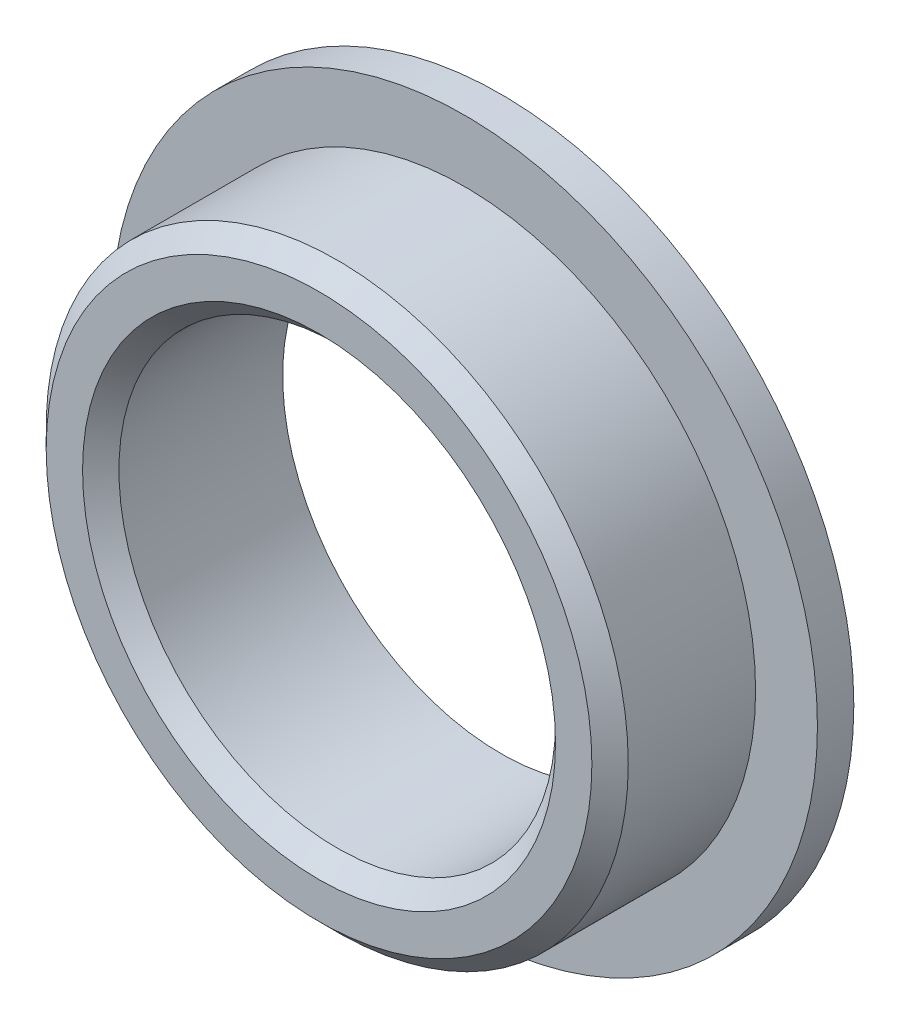
ISO-10303-21;
HEADER;
FILE_DESCRIPTION(('STEP AP214'),'2;1');
FILE_NAME('part.step','',(''),(''),'','','');
FILE_SCHEMA(('AUTOMOTIVE_DESIGN { 1 0 10303 214 1 1 1 1 }'));
ENDSEC;
DATA;
#1=APPLICATION_CONTEXT('core data for automotive mechanical design processes');
#2=APPLICATION_PROTOCOL_DEFINITION('international standard','automotive_design',2000,#1);
#3=PRODUCT_CONTEXT('',#1,'mechanical');
#4=PRODUCT('Part','Part','',(#3));
#5=PRODUCT_RELATED_PRODUCT_CATEGORY('part','',(#4));
#6=PRODUCT_DEFINITION_FORMATION('','',#4);
#7=PRODUCT_DEFINITION_CONTEXT('part definition',#1,'design');
#8=PRODUCT_DEFINITION('design','',#6,#7);
#9=PRODUCT_DEFINITION_SHAPE('','',#8);
#10=(LENGTH_UNIT() NAMED_UNIT(*) SI_UNIT(.MILLI.,.METRE.));
#11=(NAMED_UNIT(*) PLANE_ANGLE_UNIT() SI_UNIT($,.RADIAN.));
#12=(NAMED_UNIT(*) SI_UNIT($,.STERADIAN.) SOLID_ANGLE_UNIT());
#13=UNCERTAINTY_MEASURE_WITH_UNIT(LENGTH_MEASURE(1.E-05),#10,'distance_accuracy_value','');
#14=(GEOMETRIC_REPRESENTATION_CONTEXT(3) GLOBAL_UNCERTAINTY_ASSIGNED_CONTEXT((#13)) GLOBAL_UNIT_ASSIGNED_CONTEXT((#10,
#11,#12)) REPRESENTATION_CONTEXT('',''));
#15=CARTESIAN_POINT('',(0.,0.,0.));
#16=DIRECTION('',(0.,0.,1.));
#17=DIRECTION('',(1.,0.,0.));
#18=AXIS2_PLACEMENT_3D('',#15,#16,#17);
#19=CARTESIAN_POINT('',(0.,0.,0.5));
#20=DIRECTION('',(0.,0.,1.));
#21=DIRECTION('',(1.,0.,0.));
#22=AXIS2_PLACEMENT_3D('',#19,#20,#21);
#23=PLANE('',#22);
#24=CARTESIAN_POINT('',(0.,0.,0.5));
#25=DIRECTION('',(0.,0.,1.));
#26=DIRECTION('',(1.,0.,0.));
#27=AXIS2_PLACEMENT_3D('',#24,#25,#26);
#28=CIRCLE('',#27,4.85);
#29=CARTESIAN_POINT('',(4.85,0.,0.5));
#30=VERTEX_POINT('',#29);
#31=EDGE_CURVE('E50',#30,#30,#28,.T.);
#32=ORIENTED_EDGE('',*,*,#31,.T.);
#33=EDGE_LOOP('',(#32));
#34=FACE_BOUND('',#33,.T.);
#35=CARTESIAN_POINT('',(0.,0.,0.5));
#36=DIRECTION('',(0.,0.,1.));
#37=DIRECTION('',(1.,0.,0.));
#38=AXIS2_PLACEMENT_3D('',#35,#36,#37);
#39=CIRCLE('',#38,4.);
#40=CARTESIAN_POINT('',(4.,0.,0.5));
#41=VERTEX_POINT('',#40);
#42=EDGE_CURVE('E54',#41,#41,#39,.T.);
#43=ORIENTED_EDGE('',*,*,#42,.F.);
#44=EDGE_LOOP('',(#43));
#45=FACE_BOUND('',#44,.T.);
#46=ADVANCED_FACE('F30',(#34,#45),#23,.T.);
#47=CARTESIAN_POINT('',(0.,0.,0.5));
#48=DIRECTION('',(0.,0.,-1.));
#49=DIRECTION('',(-1.,0.,0.));
#50=AXIS2_PLACEMENT_3D('',#47,#48,#49);
#51=CYLINDRICAL_SURFACE('',#50,4.85);
#52=ORIENTED_EDGE('',*,*,#31,.F.);
#53=EDGE_LOOP('',(#52));
#54=FACE_BOUND('',#53,.T.);
#55=CARTESIAN_POINT('',(0.,0.,0.));
#56=DIRECTION('',(0.,0.,1.));
#57=DIRECTION('',(1.,0.,0.));
#58=AXIS2_PLACEMENT_3D('',#55,#56,#57);
#59=CIRCLE('',#58,4.85);
#60=CARTESIAN_POINT('',(4.85,0.,0.));
#61=VERTEX_POINT('',#60);
#62=EDGE_CURVE('E51',#61,#61,#59,.T.);
#63=ORIENTED_EDGE('',*,*,#62,.T.);
#64=EDGE_LOOP('',(#63));
#65=FACE_BOUND('',#64,.T.);
#66=ADVANCED_FACE('F80',(#54,#65),#51,.T.);
#67=CARTESIAN_POINT('',(0.,0.,0.));
#68=DIRECTION('',(0.,0.,1.));
#69=DIRECTION('',(1.,0.,0.));
#70=AXIS2_PLACEMENT_3D('',#67,#68,#69);
#71=PLANE('',#70);
#72=CARTESIAN_POINT('',(0.,0.,0.));
#73=DIRECTION('',(0.,0.,1.));
#74=DIRECTION('',(1.,0.,0.));
#75=AXIS2_PLACEMENT_3D('',#72,#73,#74);
#76=CIRCLE('',#75,3.);
#77=CARTESIAN_POINT('',(3.,0.,0.));
#78=VERTEX_POINT('',#77);
#79=EDGE_CURVE('E59',#78,#78,#76,.T.);
#80=ORIENTED_EDGE('',*,*,#79,.T.);
#81=EDGE_LOOP('',(#80));
#82=FACE_BOUND('',#81,.T.);
#83=ORIENTED_EDGE('',*,*,#62,.F.);
#84=EDGE_LOOP('',(#83));
#85=FACE_BOUND('',#84,.T.);
#86=ADVANCED_FACE('F63',(#82,#85),#71,.F.);
#87=CARTESIAN_POINT('',(0.,0.,2.5));
#88=DIRECTION('',(0.,0.,-1.));
#89=DIRECTION('',(-1.,0.,0.));
#90=AXIS2_PLACEMENT_3D('',#87,#88,#89);
#91=CYLINDRICAL_SURFACE('',#90,4.);
#92=CARTESIAN_POINT('',(0.,0.,2.25));
#93=DIRECTION('',(0.,0.,1.));
#94=DIRECTION('',(1.,0.,0.));
#95=AXIS2_PLACEMENT_3D('',#92,#93,#94);
#96=CIRCLE('',#95,4.);
#97=CARTESIAN_POINT('',(4.,0.,2.25));
#98=VERTEX_POINT('',#97);
#99=EDGE_CURVE('E37',#98,#98,#96,.F.);
#100=ORIENTED_EDGE('',*,*,#99,.T.);
#101=EDGE_LOOP('',(#100));
#102=FACE_BOUND('',#101,.T.);
#103=ORIENTED_EDGE('',*,*,#42,.T.);
#104=EDGE_LOOP('',(#103));
#105=FACE_BOUND('',#104,.T.);
#106=ADVANCED_FACE('F76',(#102,#105),#91,.T.);
#107=CARTESIAN_POINT('',(0.,0.,2.5));
#108=DIRECTION('',(0.,0.,1.));
#109=DIRECTION('',(1.,0.,0.));
#110=AXIS2_PLACEMENT_3D('',#107,#108,#109);
#111=PLANE('',#110);
#112=CARTESIAN_POINT('',(0.,0.,2.5));
#113=DIRECTION('',(0.,0.,1.));
#114=DIRECTION('',(1.,0.,0.));
#115=AXIS2_PLACEMENT_3D('',#112,#113,#114);
#116=CIRCLE('',#115,3.75);
#117=CARTESIAN_POINT('',(3.75,0.,2.5));
#118=VERTEX_POINT('',#117);
#119=EDGE_CURVE('E41',#118,#118,#116,.T.);
#120=ORIENTED_EDGE('',*,*,#119,.T.);
#121=EDGE_LOOP('',(#120));
#122=FACE_BOUND('',#121,.T.);
#123=CARTESIAN_POINT('',(0.,0.,2.5));
#124=DIRECTION('',(0.,0.,1.));
#125=DIRECTION('',(1.,0.,0.));
#126=AXIS2_PLACEMENT_3D('',#123,#124,#125);
#127=CIRCLE('',#126,3.25);
#128=CARTESIAN_POINT('',(3.25,0.,2.5));
#129=VERTEX_POINT('',#128);
#130=EDGE_CURVE('E45',#129,#129,#127,.F.);
#131=ORIENTED_EDGE('',*,*,#130,.T.);
#132=EDGE_LOOP('',(#131));
#133=FACE_BOUND('',#132,.T.);
#134=ADVANCED_FACE('F69',(#122,#133),#111,.T.);
#135=CARTESIAN_POINT('',(0.,0.,0.));
#136=DIRECTION('',(0.,0.,1.));
#137=DIRECTION('',(1.,0.,0.));
#138=AXIS2_PLACEMENT_3D('',#135,#136,#137);
#139=CYLINDRICAL_SURFACE('',#138,3.);
#140=CARTESIAN_POINT('',(0.,0.,2.25));
#141=DIRECTION('',(0.,0.,1.));
#142=DIRECTION('',(1.,0.,0.));
#143=AXIS2_PLACEMENT_3D('',#140,#141,#142);
#144=CIRCLE('',#143,3.);
#145=CARTESIAN_POINT('',(3.,0.,2.25));
#146=VERTEX_POINT('',#145);
#147=EDGE_CURVE('E10',#146,#146,#144,.T.);
#148=ORIENTED_EDGE('',*,*,#147,.T.);
#149=EDGE_LOOP('',(#148));
#150=FACE_BOUND('',#149,.T.);
#151=ORIENTED_EDGE('',*,*,#79,.F.);
#152=EDGE_LOOP('',(#151));
#153=FACE_BOUND('',#152,.T.);
#154=ADVANCED_FACE('F66',(#150,#153),#139,.F.);
#155=CARTESIAN_POINT('',(0.,0.,2.5));
#156=DIRECTION('',(0.,0.,-1.));
#157=DIRECTION('',(-1.,0.,0.));
#158=AXIS2_PLACEMENT_3D('',#155,#156,#157);
#159=CONICAL_SURFACE('',#158,3.75,0.785398163397447);
#160=ORIENTED_EDGE('',*,*,#99,.F.);
#161=EDGE_LOOP('',(#160));
#162=FACE_BOUND('',#161,.T.);
#163=ORIENTED_EDGE('',*,*,#119,.F.);
#164=EDGE_LOOP('',(#163));
#165=FACE_BOUND('',#164,.T.);
#166=ADVANCED_FACE('F68',(#162,#165),#159,.T.);
#167=CARTESIAN_POINT('',(0.,0.,2.25));
#168=DIRECTION('',(0.,0.,1.));
#169=DIRECTION('',(1.,0.,0.));
#170=AXIS2_PLACEMENT_3D('',#167,#168,#169);
#171=CONICAL_SURFACE('',#170,3.,0.785398163397453);
#172=ORIENTED_EDGE('',*,*,#130,.F.);
#173=EDGE_LOOP('',(#172));
#174=FACE_BOUND('',#173,.T.);
#175=ORIENTED_EDGE('',*,*,#147,.F.);
#176=EDGE_LOOP('',(#175));
#177=FACE_BOUND('',#176,.T.);
#178=ADVANCED_FACE('F32',(#174,#177),#171,.F.);
#179=CLOSED_SHELL('',(#46,#66,#86,#106,#134,#154,#166,#178));
#180=MANIFOLD_SOLID_BREP('B2',#179);
#181=ADVANCED_BREP_SHAPE_REPRESENTATION('',(#18,#180),#14);
#182=SHAPE_DEFINITION_REPRESENTATION(#9,#181);
ENDSEC;
END-ISO-10303-21;
